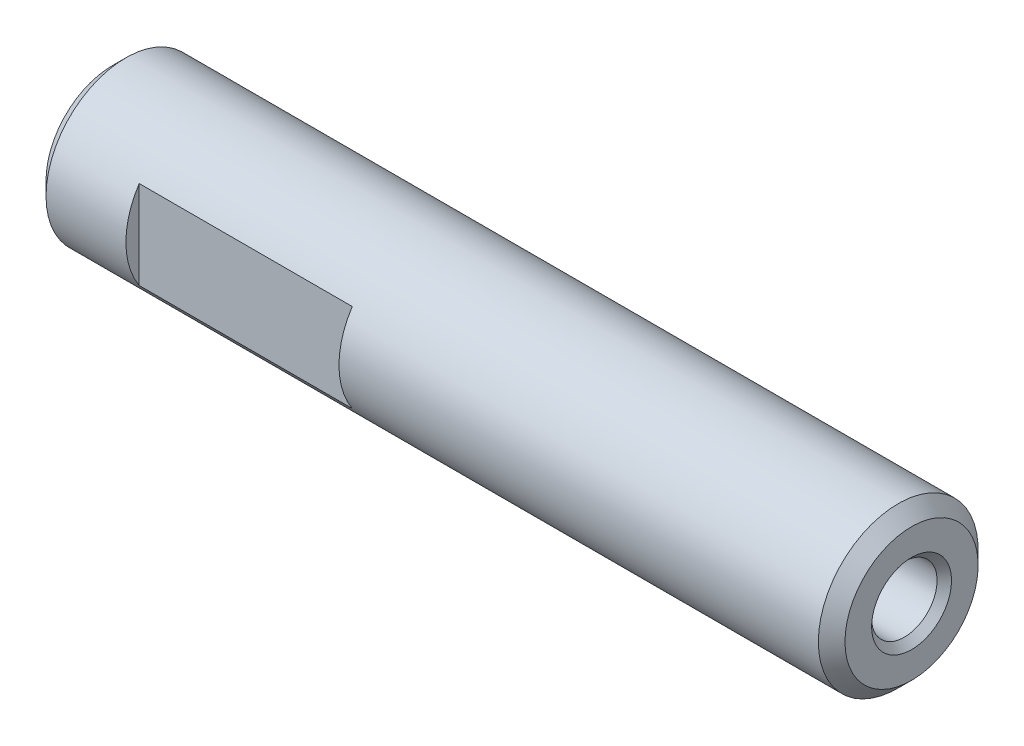
ISO-10303-21;
HEADER;
FILE_DESCRIPTION(('STEP AP214'),'2;1');
FILE_NAME('part.step','',(''),(''),'','','');
FILE_SCHEMA(('AUTOMOTIVE_DESIGN { 1 0 10303 214 1 1 1 1 }'));
ENDSEC;
DATA;
#1=APPLICATION_CONTEXT('core data for automotive mechanical design processes');
#2=APPLICATION_PROTOCOL_DEFINITION('international standard','automotive_design',2000,#1);
#3=PRODUCT_CONTEXT('',#1,'mechanical');
#4=PRODUCT('Part','Part','',(#3));
#5=PRODUCT_RELATED_PRODUCT_CATEGORY('part','',(#4));
#6=PRODUCT_DEFINITION_FORMATION('','',#4);
#7=PRODUCT_DEFINITION_CONTEXT('part definition',#1,'design');
#8=PRODUCT_DEFINITION('design','',#6,#7);
#9=PRODUCT_DEFINITION_SHAPE('','',#8);
#10=(LENGTH_UNIT() NAMED_UNIT(*) SI_UNIT(.MILLI.,.METRE.));
#11=(NAMED_UNIT(*) PLANE_ANGLE_UNIT() SI_UNIT($,.RADIAN.));
#12=(NAMED_UNIT(*) SI_UNIT($,.STERADIAN.) SOLID_ANGLE_UNIT());
#13=UNCERTAINTY_MEASURE_WITH_UNIT(LENGTH_MEASURE(1.E-05),#10,'distance_accuracy_value','');
#14=(GEOMETRIC_REPRESENTATION_CONTEXT(3) GLOBAL_UNCERTAINTY_ASSIGNED_CONTEXT((#13)) GLOBAL_UNIT_ASSIGNED_CONTEXT((#10,
#11,#12)) REPRESENTATION_CONTEXT('',''));
#15=CARTESIAN_POINT('',(0.,0.,0.));
#16=DIRECTION('',(0.,0.,1.));
#17=DIRECTION('',(1.,0.,0.));
#18=AXIS2_PLACEMENT_3D('',#15,#16,#17);
#19=CARTESIAN_POINT('',(30.,2.5,0.));
#20=DIRECTION('',(-1.,0.,0.));
#21=DIRECTION('',(0.,0.,1.));
#22=AXIS2_PLACEMENT_3D('',#19,#20,#21);
#23=PLANE('',#22);
#24=CARTESIAN_POINT('',(30.,0.,0.));
#25=DIRECTION('',(-1.,0.,0.));
#26=DIRECTION('',(0.,0.,1.));
#27=AXIS2_PLACEMENT_3D('',#24,#25,#26);
#28=CIRCLE('',#27,2.5);
#29=CARTESIAN_POINT('',(30.,0.,2.5));
#30=VERTEX_POINT('',#29);
#31=EDGE_CURVE('E133',#30,#30,#28,.T.);
#32=ORIENTED_EDGE('',*,*,#31,.F.);
#33=EDGE_LOOP('',(#32));
#34=FACE_BOUND('',#33,.T.);
#35=CARTESIAN_POINT('',(30.,0.,0.));
#36=DIRECTION('',(-1.,0.,0.));
#37=DIRECTION('',(0.,0.,1.));
#38=AXIS2_PLACEMENT_3D('',#35,#36,#37);
#39=CIRCLE('',#38,1.5);
#40=CARTESIAN_POINT('',(30.,0.,1.5));
#41=VERTEX_POINT('',#40);
#42=EDGE_CURVE('E121',#41,#41,#39,.T.);
#43=ORIENTED_EDGE('',*,*,#42,.T.);
#44=EDGE_LOOP('',(#43));
#45=FACE_BOUND('',#44,.T.);
#46=ADVANCED_FACE('F32',(#34,#45),#23,.F.);
#47=CARTESIAN_POINT('',(0.,0.,0.));
#48=DIRECTION('',(1.,0.,0.));
#49=DIRECTION('',(0.,0.,-1.));
#50=AXIS2_PLACEMENT_3D('',#47,#48,#49);
#51=PLANE('',#50);
#52=CARTESIAN_POINT('',(0.,0.,0.));
#53=DIRECTION('',(-1.,0.,0.));
#54=DIRECTION('',(0.,0.,1.));
#55=AXIS2_PLACEMENT_3D('',#52,#53,#54);
#56=CIRCLE('',#55,2.5);
#57=CARTESIAN_POINT('',(0.,0.,2.5));
#58=VERTEX_POINT('',#57);
#59=EDGE_CURVE('E87',#58,#58,#56,.T.);
#60=ORIENTED_EDGE('',*,*,#59,.T.);
#61=EDGE_LOOP('',(#60));
#62=FACE_BOUND('',#61,.T.);
#63=CARTESIAN_POINT('',(0.,0.,0.));
#64=DIRECTION('',(-1.,0.,0.));
#65=DIRECTION('',(0.,0.,1.));
#66=AXIS2_PLACEMENT_3D('',#63,#64,#65);
#67=CIRCLE('',#66,1.5);
#68=CARTESIAN_POINT('',(0.,0.,1.5));
#69=VERTEX_POINT('',#68);
#70=EDGE_CURVE('E130',#69,#69,#67,.T.);
#71=ORIENTED_EDGE('',*,*,#70,.F.);
#72=EDGE_LOOP('',(#71));
#73=FACE_BOUND('',#72,.T.);
#74=ADVANCED_FACE('F34',(#62,#73),#51,.F.);
#75=CARTESIAN_POINT('',(0.5,0.,0.));
#76=DIRECTION('',(1.,0.,0.));
#77=DIRECTION('',(0.,0.,-1.));
#78=AXIS2_PLACEMENT_3D('',#75,#76,#77);
#79=CONICAL_SURFACE('',#78,3.,0.785398163397448);
#80=ORIENTED_EDGE('',*,*,#59,.F.);
#81=EDGE_LOOP('',(#80));
#82=FACE_BOUND('',#81,.T.);
#83=CARTESIAN_POINT('',(0.5,0.,0.));
#84=DIRECTION('',(-1.,0.,0.));
#85=DIRECTION('',(0.,0.,1.));
#86=AXIS2_PLACEMENT_3D('',#83,#84,#85);
#87=CIRCLE('',#86,3.);
#88=CARTESIAN_POINT('',(0.5,0.,3.));
#89=VERTEX_POINT('',#88);
#90=EDGE_CURVE('E139',#89,#89,#87,.T.);
#91=ORIENTED_EDGE('',*,*,#90,.T.);
#92=EDGE_LOOP('',(#91));
#93=FACE_BOUND('',#92,.T.);
#94=ADVANCED_FACE('F147',(#82,#93),#79,.T.);
#95=CARTESIAN_POINT('',(30.,0.,0.));
#96=DIRECTION('',(-1.,0.,0.));
#97=DIRECTION('',(0.,0.,1.));
#98=AXIS2_PLACEMENT_3D('',#95,#96,#97);
#99=CYLINDRICAL_SURFACE('',#98,3.);
#100=CARTESIAN_POINT('',(11.5,0.,0.));
#101=DIRECTION('',(1.,0.,0.));
#102=DIRECTION('',(0.,0.,-1.));
#103=AXIS2_PLACEMENT_3D('',#100,#101,#102);
#104=CIRCLE('',#103,3.);
#105=CARTESIAN_POINT('',(11.5,1.6583123951777,2.5));
#106=VERTEX_POINT('',#105);
#107=CARTESIAN_POINT('',(11.5,-1.6583123951777,2.5));
#108=VERTEX_POINT('',#107);
#109=EDGE_CURVE('E40',#106,#108,#104,.T.);
#110=ORIENTED_EDGE('',*,*,#109,.T.);
#111=DIRECTION('',(-1.,0.,0.));
#112=VECTOR('',#111,1.);
#113=CARTESIAN_POINT('',(30.,-1.6583123951777,2.5));
#114=LINE('',#113,#112);
#115=CARTESIAN_POINT('',(3.5,-1.6583123951777,2.5));
#116=VERTEX_POINT('',#115);
#117=EDGE_CURVE('E11',#108,#116,#114,.T.);
#118=ORIENTED_EDGE('',*,*,#117,.T.);
#119=CARTESIAN_POINT('',(3.5,0.,0.));
#120=DIRECTION('',(1.,0.,0.));
#121=DIRECTION('',(0.,0.,-1.));
#122=AXIS2_PLACEMENT_3D('',#119,#120,#121);
#123=CIRCLE('',#122,3.);
#124=CARTESIAN_POINT('',(3.5,1.6583123951777,2.5));
#125=VERTEX_POINT('',#124);
#126=EDGE_CURVE('E98',#125,#116,#123,.T.);
#127=ORIENTED_EDGE('',*,*,#126,.F.);
#128=DIRECTION('',(-1.,0.,0.));
#129=VECTOR('',#128,1.);
#130=CARTESIAN_POINT('',(30.,1.6583123951777,2.5));
#131=LINE('',#130,#129);
#132=EDGE_CURVE('E100',#125,#106,#131,.F.);
#133=ORIENTED_EDGE('',*,*,#132,.T.);
#134=EDGE_LOOP('',(#110,#118,#127,#133));
#135=FACE_BOUND('',#134,.T.);
#136=CARTESIAN_POINT('',(11.5,-1.6583123951777,-2.5));
#137=VERTEX_POINT('',#136);
#138=CARTESIAN_POINT('',(11.5,1.6583123951777,-2.5));
#139=VERTEX_POINT('',#138);
#140=EDGE_CURVE('E96',#137,#139,#104,.T.);
#141=ORIENTED_EDGE('',*,*,#140,.T.);
#142=DIRECTION('',(-1.,0.,0.));
#143=VECTOR('',#142,1.);
#144=CARTESIAN_POINT('',(30.,1.6583123951777,-2.5));
#145=LINE('',#144,#143);
#146=CARTESIAN_POINT('',(3.5,1.6583123951777,-2.5));
#147=VERTEX_POINT('',#146);
#148=EDGE_CURVE('E95',#139,#147,#145,.T.);
#149=ORIENTED_EDGE('',*,*,#148,.T.);
#150=CARTESIAN_POINT('',(3.5,-1.6583123951777,-2.5));
#151=VERTEX_POINT('',#150);
#152=EDGE_CURVE('E86',#151,#147,#123,.T.);
#153=ORIENTED_EDGE('',*,*,#152,.F.);
#154=DIRECTION('',(-1.,0.,0.));
#155=VECTOR('',#154,1.);
#156=CARTESIAN_POINT('',(30.,-1.6583123951777,-2.5));
#157=LINE('',#156,#155);
#158=EDGE_CURVE('E78',#151,#137,#157,.F.);
#159=ORIENTED_EDGE('',*,*,#158,.T.);
#160=EDGE_LOOP('',(#141,#149,#153,#159));
#161=FACE_BOUND('',#160,.T.);
#162=ORIENTED_EDGE('',*,*,#90,.F.);
#163=EDGE_LOOP('',(#162));
#164=FACE_BOUND('',#163,.T.);
#165=CARTESIAN_POINT('',(29.5,0.,0.));
#166=DIRECTION('',(-1.,0.,0.));
#167=DIRECTION('',(0.,0.,1.));
#168=AXIS2_PLACEMENT_3D('',#165,#166,#167);
#169=CIRCLE('',#168,3.);
#170=CARTESIAN_POINT('',(29.5,0.,3.));
#171=VERTEX_POINT('',#170);
#172=EDGE_CURVE('E136',#171,#171,#169,.T.);
#173=ORIENTED_EDGE('',*,*,#172,.T.);
#174=EDGE_LOOP('',(#173));
#175=FACE_BOUND('',#174,.T.);
#176=ADVANCED_FACE('F93',(#135,#161,#164,#175),#99,.T.);
#177=CARTESIAN_POINT('',(30.,0.,0.));
#178=DIRECTION('',(-1.,0.,0.));
#179=DIRECTION('',(0.,0.,1.));
#180=AXIS2_PLACEMENT_3D('',#177,#178,#179);
#181=CONICAL_SURFACE('',#180,2.5,0.785398163397448);
#182=ORIENTED_EDGE('',*,*,#172,.F.);
#183=EDGE_LOOP('',(#182));
#184=FACE_BOUND('',#183,.T.);
#185=ORIENTED_EDGE('',*,*,#31,.T.);
#186=EDGE_LOOP('',(#185));
#187=FACE_BOUND('',#186,.T.);
#188=ADVANCED_FACE('F153',(#184,#187),#181,.T.);
#189=CARTESIAN_POINT('',(0.2705,0.,0.));
#190=DIRECTION('',(-1.,0.,0.));
#191=DIRECTION('',(0.,0.,1.));
#192=AXIS2_PLACEMENT_3D('',#189,#190,#191);
#193=CONICAL_SURFACE('',#192,1.2295,0.785398163397449);
#194=ORIENTED_EDGE('',*,*,#70,.T.);
#195=EDGE_LOOP('',(#194));
#196=FACE_BOUND('',#195,.T.);
#197=CARTESIAN_POINT('',(0.2705,0.,0.));
#198=DIRECTION('',(-1.,0.,0.));
#199=DIRECTION('',(0.,0.,1.));
#200=AXIS2_PLACEMENT_3D('',#197,#198,#199);
#201=CIRCLE('',#200,1.2295);
#202=CARTESIAN_POINT('',(0.2705,0.,1.2295));
#203=VERTEX_POINT('',#202);
#204=EDGE_CURVE('E127',#203,#203,#201,.T.);
#205=ORIENTED_EDGE('',*,*,#204,.F.);
#206=EDGE_LOOP('',(#205));
#207=FACE_BOUND('',#206,.T.);
#208=ADVANCED_FACE('F159',(#196,#207),#193,.F.);
#209=CARTESIAN_POINT('',(7.2,0.,0.));
#210=DIRECTION('',(-1.,0.,0.));
#211=DIRECTION('',(0.,0.,1.));
#212=AXIS2_PLACEMENT_3D('',#209,#210,#211);
#213=CYLINDRICAL_SURFACE('',#212,1.2295);
#214=ORIENTED_EDGE('',*,*,#204,.T.);
#215=EDGE_LOOP('',(#214));
#216=FACE_BOUND('',#215,.T.);
#217=CARTESIAN_POINT('',(6.4901478440314,0.,0.));
#218=DIRECTION('',(-1.,0.,0.));
#219=DIRECTION('',(0.,0.,1.));
#220=AXIS2_PLACEMENT_3D('',#217,#218,#219);
#221=CIRCLE('',#220,1.2295);
#222=CARTESIAN_POINT('',(6.4901478440314,0.,1.2295));
#223=VERTEX_POINT('',#222);
#224=EDGE_CURVE('E124',#223,#223,#221,.T.);
#225=ORIENTED_EDGE('',*,*,#224,.F.);
#226=EDGE_LOOP('',(#225));
#227=FACE_BOUND('',#226,.T.);
#228=ADVANCED_FACE('F181',(#216,#227),#213,.F.);
#229=CARTESIAN_POINT('',(7.2,0.,0.));
#230=DIRECTION('',(-1.,0.,0.));
#231=DIRECTION('',(0.,0.,1.));
#232=AXIS2_PLACEMENT_3D('',#229,#230,#231);
#233=CONICAL_SURFACE('',#232,0.,1.04719755119663);
#234=ORIENTED_EDGE('',*,*,#224,.T.);
#235=EDGE_LOOP('',(#234));
#236=FACE_BOUND('',#235,.T.);
#237=CARTESIAN_POINT('',(7.2,0.,0.));
#238=VERTEX_POINT('',#237);
#239=VERTEX_LOOP('',#238);
#240=FACE_BOUND('',#239,.T.);
#241=ADVANCED_FACE('F171',(#236,#240),#233,.F.);
#242=CARTESIAN_POINT('',(30.,0.,0.));
#243=DIRECTION('',(1.,0.,0.));
#244=DIRECTION('',(0.,0.,-1.));
#245=AXIS2_PLACEMENT_3D('',#242,#243,#244);
#246=CONICAL_SURFACE('',#245,1.5,0.785398163397449);
#247=CARTESIAN_POINT('',(29.7295,0.,0.));
#248=DIRECTION('',(-1.,0.,0.));
#249=DIRECTION('',(0.,0.,1.));
#250=AXIS2_PLACEMENT_3D('',#247,#248,#249);
#251=CIRCLE('',#250,1.2295);
#252=CARTESIAN_POINT('',(29.7295,0.,1.2295));
#253=VERTEX_POINT('',#252);
#254=EDGE_CURVE('E118',#253,#253,#251,.T.);
#255=ORIENTED_EDGE('',*,*,#254,.T.);
#256=EDGE_LOOP('',(#255));
#257=FACE_BOUND('',#256,.T.);
#258=ORIENTED_EDGE('',*,*,#42,.F.);
#259=EDGE_LOOP('',(#258));
#260=FACE_BOUND('',#259,.T.);
#261=ADVANCED_FACE('F168',(#257,#260),#246,.F.);
#262=CARTESIAN_POINT('',(30.,0.,0.));
#263=DIRECTION('',(-1.,0.,0.));
#264=DIRECTION('',(0.,0.,1.));
#265=AXIS2_PLACEMENT_3D('',#262,#263,#264);
#266=CYLINDRICAL_SURFACE('',#265,1.2295);
#267=CARTESIAN_POINT('',(23.509852155969,0.,0.));
#268=DIRECTION('',(-1.,0.,0.));
#269=DIRECTION('',(0.,0.,1.));
#270=AXIS2_PLACEMENT_3D('',#267,#268,#269);
#271=CIRCLE('',#270,1.2295);
#272=CARTESIAN_POINT('',(23.509852155969,0.,1.2295));
#273=VERTEX_POINT('',#272);
#274=EDGE_CURVE('E115',#273,#273,#271,.T.);
#275=ORIENTED_EDGE('',*,*,#274,.T.);
#276=EDGE_LOOP('',(#275));
#277=FACE_BOUND('',#276,.T.);
#278=ORIENTED_EDGE('',*,*,#254,.F.);
#279=EDGE_LOOP('',(#278));
#280=FACE_BOUND('',#279,.T.);
#281=ADVANCED_FACE('F170',(#277,#280),#266,.F.);
#282=CARTESIAN_POINT('',(23.509852155969,0.,0.));
#283=DIRECTION('',(1.,0.,0.));
#284=DIRECTION('',(0.,0.,-1.));
#285=AXIS2_PLACEMENT_3D('',#282,#283,#284);
#286=CONICAL_SURFACE('',#285,1.2295,1.04719755119638);
#287=CARTESIAN_POINT('',(22.8,0.,0.));
#288=VERTEX_POINT('',#287);
#289=VERTEX_LOOP('',#288);
#290=FACE_BOUND('',#289,.T.);
#291=ORIENTED_EDGE('',*,*,#274,.F.);
#292=EDGE_LOOP('',(#291));
#293=FACE_BOUND('',#292,.T.);
#294=ADVANCED_FACE('F178',(#290,#293),#286,.F.);
#295=CARTESIAN_POINT('',(11.5,-6.,-2.5));
#296=DIRECTION('',(0.,0.,1.));
#297=DIRECTION('',(1.,0.,0.));
#298=AXIS2_PLACEMENT_3D('',#295,#296,#297);
#299=PLANE('',#298);
#300=DIRECTION('',(0.,1.,0.));
#301=VECTOR('',#300,1.);
#302=CARTESIAN_POINT('',(11.5,-6.,-2.5));
#303=LINE('',#302,#301);
#304=EDGE_CURVE('E55',#137,#139,#303,.T.);
#305=ORIENTED_EDGE('',*,*,#304,.F.);
#306=ORIENTED_EDGE('',*,*,#158,.F.);
#307=DIRECTION('',(0.,1.,0.));
#308=VECTOR('',#307,1.);
#309=CARTESIAN_POINT('',(3.5,-6.,-2.5));
#310=LINE('',#309,#308);
#311=EDGE_CURVE('E81',#151,#147,#310,.T.);
#312=ORIENTED_EDGE('',*,*,#311,.T.);
#313=ORIENTED_EDGE('',*,*,#148,.F.);
#314=EDGE_LOOP('',(#305,#306,#312,#313));
#315=FACE_BOUND('',#314,.T.);
#316=ADVANCED_FACE('F80',(#315),#299,.F.);
#317=CARTESIAN_POINT('',(3.5,12.,5.));
#318=DIRECTION('',(1.,0.,0.));
#319=DIRECTION('',(0.,0.,-1.));
#320=AXIS2_PLACEMENT_3D('',#317,#318,#319);
#321=PLANE('',#320);
#322=ORIENTED_EDGE('',*,*,#152,.T.);
#323=ORIENTED_EDGE('',*,*,#311,.F.);
#324=EDGE_LOOP('',(#322,#323));
#325=FACE_BOUND('',#324,.T.);
#326=ADVANCED_FACE('F90',(#325),#321,.T.);
#327=CARTESIAN_POINT('',(11.5,12.,5.));
#328=DIRECTION('',(1.,0.,0.));
#329=DIRECTION('',(0.,0.,-1.));
#330=AXIS2_PLACEMENT_3D('',#327,#328,#329);
#331=PLANE('',#330);
#332=ORIENTED_EDGE('',*,*,#304,.T.);
#333=ORIENTED_EDGE('',*,*,#140,.F.);
#334=EDGE_LOOP('',(#332,#333));
#335=FACE_BOUND('',#334,.T.);
#336=ADVANCED_FACE('F271',(#335),#331,.F.);
#337=DIRECTION('',(0.,-1.,0.));
#338=VECTOR('',#337,1.);
#339=CARTESIAN_POINT('',(11.5,6.,2.5));
#340=LINE('',#339,#338);
#341=EDGE_CURVE('E47',#106,#108,#340,.T.);
#342=ORIENTED_EDGE('',*,*,#341,.T.);
#343=ORIENTED_EDGE('',*,*,#109,.F.);
#344=EDGE_LOOP('',(#342,#343));
#345=FACE_BOUND('',#344,.T.);
#346=ADVANCED_FACE('F279',(#345),#331,.F.);
#347=ORIENTED_EDGE('',*,*,#126,.T.);
#348=DIRECTION('',(0.,-1.,0.));
#349=VECTOR('',#348,1.);
#350=CARTESIAN_POINT('',(3.5,6.,2.5));
#351=LINE('',#350,#349);
#352=EDGE_CURVE('E91',#125,#116,#351,.T.);
#353=ORIENTED_EDGE('',*,*,#352,.F.);
#354=EDGE_LOOP('',(#347,#353));
#355=FACE_BOUND('',#354,.T.);
#356=ADVANCED_FACE('F110',(#355),#321,.T.);
#357=CARTESIAN_POINT('',(11.5,6.,2.5));
#358=DIRECTION('',(0.,0.,-1.));
#359=DIRECTION('',(-1.,0.,0.));
#360=AXIS2_PLACEMENT_3D('',#357,#358,#359);
#361=PLANE('',#360);
#362=ORIENTED_EDGE('',*,*,#341,.F.);
#363=ORIENTED_EDGE('',*,*,#132,.F.);
#364=ORIENTED_EDGE('',*,*,#352,.T.);
#365=ORIENTED_EDGE('',*,*,#117,.F.);
#366=EDGE_LOOP('',(#362,#363,#364,#365));
#367=FACE_BOUND('',#366,.T.);
#368=ADVANCED_FACE('F109',(#367),#361,.F.);
#369=CLOSED_SHELL('',(#46,#74,#94,#176,#188,#208,#228,#241,#261,#281,#294,#316,#326,#336,#346,
#356,#368));
#370=MANIFOLD_SOLID_BREP('B2',#369);
#371=ADVANCED_BREP_SHAPE_REPRESENTATION('',(#18,#370),#14);
#372=SHAPE_DEFINITION_REPRESENTATION(#9,#371);
ENDSEC;
END-ISO-10303-21;
